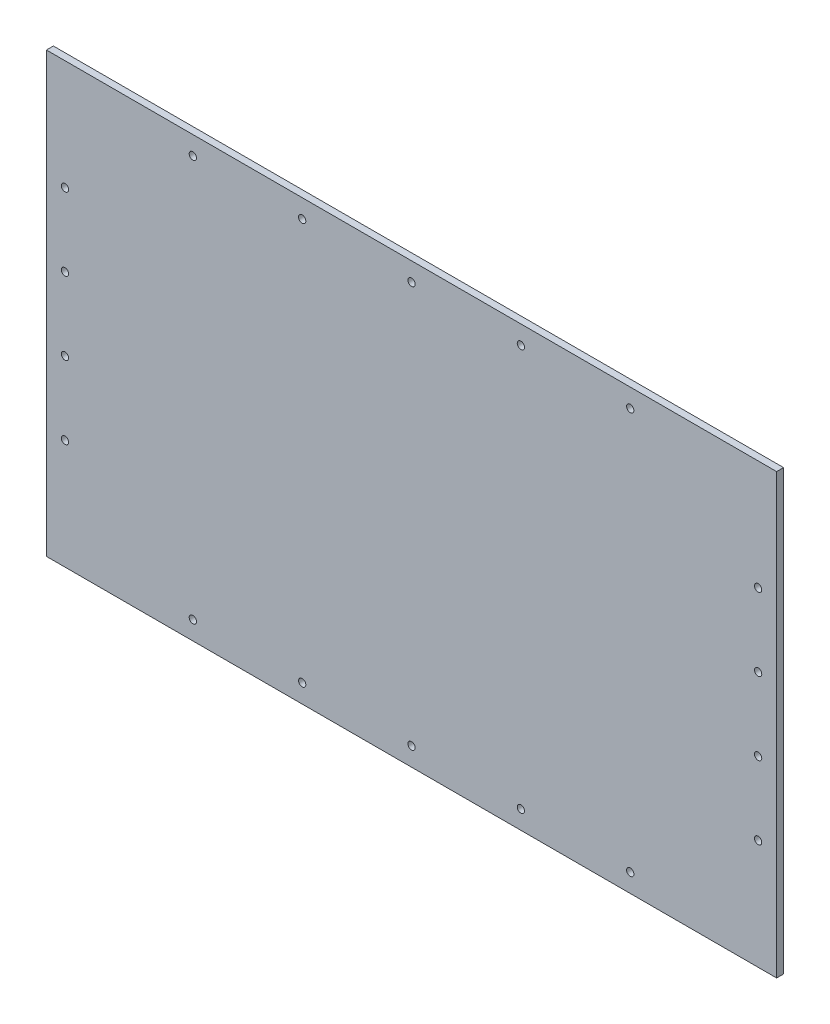
ISO-10303-21;
HEADER;
FILE_DESCRIPTION(('STEP AP214'),'2;1');
FILE_NAME('part.step','',(''),(''),'','','');
FILE_SCHEMA(('AUTOMOTIVE_DESIGN { 1 0 10303 214 1 1 1 1 }'));
ENDSEC;
DATA;
#1=APPLICATION_CONTEXT('core data for automotive mechanical design processes');
#2=APPLICATION_PROTOCOL_DEFINITION('international standard','automotive_design',2000,#1);
#3=PRODUCT_CONTEXT('',#1,'mechanical');
#4=PRODUCT('Part','Part','',(#3));
#5=PRODUCT_RELATED_PRODUCT_CATEGORY('part','',(#4));
#6=PRODUCT_DEFINITION_FORMATION('','',#4);
#7=PRODUCT_DEFINITION_CONTEXT('part definition',#1,'design');
#8=PRODUCT_DEFINITION('design','',#6,#7);
#9=PRODUCT_DEFINITION_SHAPE('','',#8);
#10=(LENGTH_UNIT() NAMED_UNIT(*) SI_UNIT(.MILLI.,.METRE.));
#11=(NAMED_UNIT(*) PLANE_ANGLE_UNIT() SI_UNIT($,.RADIAN.));
#12=(NAMED_UNIT(*) SI_UNIT($,.STERADIAN.) SOLID_ANGLE_UNIT());
#13=UNCERTAINTY_MEASURE_WITH_UNIT(LENGTH_MEASURE(1.E-05),#10,'distance_accuracy_value','');
#14=(GEOMETRIC_REPRESENTATION_CONTEXT(3) GLOBAL_UNCERTAINTY_ASSIGNED_CONTEXT((#13)) GLOBAL_UNIT_ASSIGNED_CONTEXT((#10,
#11,#12)) REPRESENTATION_CONTEXT('',''));
#15=CARTESIAN_POINT('',(0.,0.,0.));
#16=DIRECTION('',(0.,0.,1.));
#17=DIRECTION('',(1.,0.,0.));
#18=AXIS2_PLACEMENT_3D('',#15,#16,#17);
#19=CARTESIAN_POINT('',(-250.4,150.400000000001,4.75));
#20=DIRECTION('',(1.,0.,0.));
#21=DIRECTION('',(0.,1.,0.));
#22=AXIS2_PLACEMENT_3D('',#19,#20,#21);
#23=PLANE('',#22);
#24=DIRECTION('',(0.,-1.,0.));
#25=VECTOR('',#24,1.);
#26=CARTESIAN_POINT('',(-250.4,150.400000000001,0.));
#27=LINE('',#26,#25);
#28=CARTESIAN_POINT('',(-250.4,150.400000000001,0.));
#29=VERTEX_POINT('',#28);
#30=CARTESIAN_POINT('',(-250.4,-150.399999999999,0.));
#31=VERTEX_POINT('',#30);
#32=EDGE_CURVE('E98',#29,#31,#27,.T.);
#33=ORIENTED_EDGE('',*,*,#32,.T.);
#34=DIRECTION('',(0.,0.,-1.));
#35=VECTOR('',#34,1.);
#36=CARTESIAN_POINT('',(-250.4,-150.399999999999,4.75));
#37=LINE('',#36,#35);
#38=CARTESIAN_POINT('',(-250.4,-150.399999999999,4.75));
#39=VERTEX_POINT('',#38);
#40=EDGE_CURVE('E11',#39,#31,#37,.T.);
#41=ORIENTED_EDGE('',*,*,#40,.F.);
#42=DIRECTION('',(0.,-1.,0.));
#43=VECTOR('',#42,1.);
#44=CARTESIAN_POINT('',(-250.4,150.400000000001,4.75));
#45=LINE('',#44,#43);
#46=CARTESIAN_POINT('',(-250.4,150.400000000001,4.75));
#47=VERTEX_POINT('',#46);
#48=EDGE_CURVE('E84',#47,#39,#45,.T.);
#49=ORIENTED_EDGE('',*,*,#48,.F.);
#50=DIRECTION('',(0.,0.,-1.));
#51=VECTOR('',#50,1.);
#52=CARTESIAN_POINT('',(-250.4,150.400000000001,4.75));
#53=LINE('',#52,#51);
#54=EDGE_CURVE('E51',#47,#29,#53,.T.);
#55=ORIENTED_EDGE('',*,*,#54,.T.);
#56=EDGE_LOOP('',(#33,#41,#49,#55));
#57=FACE_BOUND('',#56,.T.);
#58=ADVANCED_FACE('F35',(#57),#23,.F.);
#59=CARTESIAN_POINT('',(-250.4,-150.399999999999,4.75));
#60=DIRECTION('',(0.,1.,0.));
#61=DIRECTION('',(0.,0.,1.));
#62=AXIS2_PLACEMENT_3D('',#59,#60,#61);
#63=PLANE('',#62);
#64=DIRECTION('',(1.,0.,0.));
#65=VECTOR('',#64,1.);
#66=CARTESIAN_POINT('',(-250.4,-150.399999999999,0.));
#67=LINE('',#66,#65);
#68=CARTESIAN_POINT('',(250.4,-150.399999999999,0.));
#69=VERTEX_POINT('',#68);
#70=EDGE_CURVE('E89',#31,#69,#67,.T.);
#71=ORIENTED_EDGE('',*,*,#70,.T.);
#72=DIRECTION('',(0.,0.,-1.));
#73=VECTOR('',#72,1.);
#74=CARTESIAN_POINT('',(250.4,-150.399999999999,4.75));
#75=LINE('',#74,#73);
#76=CARTESIAN_POINT('',(250.4,-150.399999999999,4.75));
#77=VERTEX_POINT('',#76);
#78=EDGE_CURVE('E43',#77,#69,#75,.T.);
#79=ORIENTED_EDGE('',*,*,#78,.F.);
#80=DIRECTION('',(1.,0.,0.));
#81=VECTOR('',#80,1.);
#82=CARTESIAN_POINT('',(-250.4,-150.399999999999,4.75));
#83=LINE('',#82,#81);
#84=EDGE_CURVE('E76',#39,#77,#83,.T.);
#85=ORIENTED_EDGE('',*,*,#84,.F.);
#86=ORIENTED_EDGE('',*,*,#40,.T.);
#87=EDGE_LOOP('',(#71,#79,#85,#86));
#88=FACE_BOUND('',#87,.T.);
#89=ADVANCED_FACE('F88',(#88),#63,.F.);
#90=CARTESIAN_POINT('',(250.4,150.400000000001,4.75));
#91=DIRECTION('',(1.,0.,0.));
#92=DIRECTION('',(0.,1.,0.));
#93=AXIS2_PLACEMENT_3D('',#90,#91,#92);
#94=PLANE('',#93);
#95=DIRECTION('',(0.,-1.,0.));
#96=VECTOR('',#95,1.);
#97=CARTESIAN_POINT('',(250.4,150.400000000001,0.));
#98=LINE('',#97,#96);
#99=CARTESIAN_POINT('',(250.4,150.400000000001,0.));
#100=VERTEX_POINT('',#99);
#101=EDGE_CURVE('E102',#100,#69,#98,.T.);
#102=ORIENTED_EDGE('',*,*,#101,.F.);
#103=DIRECTION('',(0.,0.,-1.));
#104=VECTOR('',#103,1.);
#105=CARTESIAN_POINT('',(250.4,150.400000000001,4.75));
#106=LINE('',#105,#104);
#107=CARTESIAN_POINT('',(250.4,150.400000000001,4.75));
#108=VERTEX_POINT('',#107);
#109=EDGE_CURVE('E65',#108,#100,#106,.T.);
#110=ORIENTED_EDGE('',*,*,#109,.F.);
#111=DIRECTION('',(0.,-1.,0.));
#112=VECTOR('',#111,1.);
#113=CARTESIAN_POINT('',(250.4,150.400000000001,4.75));
#114=LINE('',#113,#112);
#115=EDGE_CURVE('E83',#108,#77,#114,.T.);
#116=ORIENTED_EDGE('',*,*,#115,.T.);
#117=ORIENTED_EDGE('',*,*,#78,.T.);
#118=EDGE_LOOP('',(#102,#110,#116,#117));
#119=FACE_BOUND('',#118,.T.);
#120=ADVANCED_FACE('F92',(#119),#94,.T.);
#121=CARTESIAN_POINT('',(-250.4,150.400000000001,4.75));
#122=DIRECTION('',(0.,1.,0.));
#123=DIRECTION('',(0.,0.,1.));
#124=AXIS2_PLACEMENT_3D('',#121,#122,#123);
#125=PLANE('',#124);
#126=DIRECTION('',(1.,0.,0.));
#127=VECTOR('',#126,1.);
#128=CARTESIAN_POINT('',(-250.4,150.400000000001,0.));
#129=LINE('',#128,#127);
#130=EDGE_CURVE('E104',#29,#100,#129,.T.);
#131=ORIENTED_EDGE('',*,*,#130,.F.);
#132=ORIENTED_EDGE('',*,*,#54,.F.);
#133=DIRECTION('',(1.,0.,0.));
#134=VECTOR('',#133,1.);
#135=CARTESIAN_POINT('',(-250.4,150.400000000001,4.75));
#136=LINE('',#135,#134);
#137=EDGE_CURVE('E93',#47,#108,#136,.T.);
#138=ORIENTED_EDGE('',*,*,#137,.T.);
#139=ORIENTED_EDGE('',*,*,#109,.T.);
#140=EDGE_LOOP('',(#131,#132,#138,#139));
#141=FACE_BOUND('',#140,.T.);
#142=ADVANCED_FACE('F258',(#141),#125,.T.);
#143=CARTESIAN_POINT('',(0.,0.,4.75));
#144=DIRECTION('',(0.,0.,1.));
#145=DIRECTION('',(1.,0.,0.));
#146=AXIS2_PLACEMENT_3D('',#143,#144,#145);
#147=PLANE('',#146);
#148=CARTESIAN_POINT('',(-150.,-137.699999999999,4.75));
#149=DIRECTION('',(0.,0.,1.));
#150=DIRECTION('',(1.,0.,0.));
#151=AXIS2_PLACEMENT_3D('',#148,#149,#150);
#152=CIRCLE('',#151,2.5);
#153=CARTESIAN_POINT('',(-147.5,-137.699999999999,4.75));
#154=VERTEX_POINT('',#153);
#155=EDGE_CURVE('E180',#154,#154,#152,.T.);
#156=ORIENTED_EDGE('',*,*,#155,.F.);
#157=EDGE_LOOP('',(#156));
#158=FACE_BOUND('',#157,.T.);
#159=CARTESIAN_POINT('',(-75.,-137.7,4.75));
#160=DIRECTION('',(0.,0.,1.));
#161=DIRECTION('',(1.,0.,0.));
#162=AXIS2_PLACEMENT_3D('',#159,#160,#161);
#163=CIRCLE('',#162,2.5);
#164=CARTESIAN_POINT('',(-72.5,-137.7,4.75));
#165=VERTEX_POINT('',#164);
#166=EDGE_CURVE('E190',#165,#165,#163,.T.);
#167=ORIENTED_EDGE('',*,*,#166,.F.);
#168=EDGE_LOOP('',(#167));
#169=FACE_BOUND('',#168,.T.);
#170=CARTESIAN_POINT('',(0.,-137.7,4.75));
#171=DIRECTION('',(0.,0.,1.));
#172=DIRECTION('',(1.,0.,0.));
#173=AXIS2_PLACEMENT_3D('',#170,#171,#172);
#174=CIRCLE('',#173,2.5);
#175=CARTESIAN_POINT('',(2.50000000000002,-137.7,4.75));
#176=VERTEX_POINT('',#175);
#177=EDGE_CURVE('E193',#176,#176,#174,.T.);
#178=ORIENTED_EDGE('',*,*,#177,.F.);
#179=EDGE_LOOP('',(#178));
#180=FACE_BOUND('',#179,.T.);
#181=CARTESIAN_POINT('',(75.,-137.700000000001,4.75));
#182=DIRECTION('',(0.,0.,1.));
#183=DIRECTION('',(1.,0.,0.));
#184=AXIS2_PLACEMENT_3D('',#181,#182,#183);
#185=CIRCLE('',#184,2.5);
#186=CARTESIAN_POINT('',(77.5,-137.700000000001,4.75));
#187=VERTEX_POINT('',#186);
#188=EDGE_CURVE('E196',#187,#187,#185,.T.);
#189=ORIENTED_EDGE('',*,*,#188,.F.);
#190=EDGE_LOOP('',(#189));
#191=FACE_BOUND('',#190,.T.);
#192=CARTESIAN_POINT('',(150.,-137.700000000001,4.75));
#193=DIRECTION('',(0.,0.,1.));
#194=DIRECTION('',(1.,0.,0.));
#195=AXIS2_PLACEMENT_3D('',#192,#193,#194);
#196=CIRCLE('',#195,2.5);
#197=CARTESIAN_POINT('',(152.5,-137.700000000001,4.75));
#198=VERTEX_POINT('',#197);
#199=EDGE_CURVE('E199',#198,#198,#196,.T.);
#200=ORIENTED_EDGE('',*,*,#199,.F.);
#201=EDGE_LOOP('',(#200));
#202=FACE_BOUND('',#201,.T.);
#203=CARTESIAN_POINT('',(-237.7,75.0000000000008,4.75));
#204=DIRECTION('',(0.,0.,1.));
#205=DIRECTION('',(1.,0.,0.));
#206=AXIS2_PLACEMENT_3D('',#203,#204,#205);
#207=CIRCLE('',#206,2.5);
#208=CARTESIAN_POINT('',(-235.2,75.0000000000008,4.75));
#209=VERTEX_POINT('',#208);
#210=EDGE_CURVE('E156',#209,#209,#207,.T.);
#211=ORIENTED_EDGE('',*,*,#210,.F.);
#212=EDGE_LOOP('',(#211));
#213=FACE_BOUND('',#212,.T.);
#214=CARTESIAN_POINT('',(-237.700000000001,25.0000000000007,4.75));
#215=DIRECTION('',(0.,0.,1.));
#216=DIRECTION('',(1.,0.,0.));
#217=AXIS2_PLACEMENT_3D('',#214,#215,#216);
#218=CIRCLE('',#217,2.5);
#219=CARTESIAN_POINT('',(-235.200000000001,25.0000000000007,4.75));
#220=VERTEX_POINT('',#219);
#221=EDGE_CURVE('E166',#220,#220,#218,.T.);
#222=ORIENTED_EDGE('',*,*,#221,.F.);
#223=EDGE_LOOP('',(#222));
#224=FACE_BOUND('',#223,.T.);
#225=CARTESIAN_POINT('',(-237.700000000001,-24.9999999999993,4.75));
#226=DIRECTION('',(0.,0.,1.));
#227=DIRECTION('',(1.,0.,0.));
#228=AXIS2_PLACEMENT_3D('',#225,#226,#227);
#229=CIRCLE('',#228,2.5);
#230=CARTESIAN_POINT('',(-235.200000000001,-24.9999999999993,4.75));
#231=VERTEX_POINT('',#230);
#232=EDGE_CURVE('E169',#231,#231,#229,.T.);
#233=ORIENTED_EDGE('',*,*,#232,.F.);
#234=EDGE_LOOP('',(#233));
#235=FACE_BOUND('',#234,.T.);
#236=CARTESIAN_POINT('',(-237.700000000002,-74.9999999999993,4.75));
#237=DIRECTION('',(0.,0.,1.));
#238=DIRECTION('',(1.,0.,0.));
#239=AXIS2_PLACEMENT_3D('',#236,#237,#238);
#240=CIRCLE('',#239,2.5);
#241=CARTESIAN_POINT('',(-235.200000000002,-74.9999999999993,4.75));
#242=VERTEX_POINT('',#241);
#243=EDGE_CURVE('E172',#242,#242,#240,.T.);
#244=ORIENTED_EDGE('',*,*,#243,.F.);
#245=EDGE_LOOP('',(#244));
#246=FACE_BOUND('',#245,.T.);
#247=CARTESIAN_POINT('',(237.7,75.0000000000008,4.75));
#248=DIRECTION('',(0.,0.,1.));
#249=DIRECTION('',(1.,0.,0.));
#250=AXIS2_PLACEMENT_3D('',#247,#248,#249);
#251=CIRCLE('',#250,2.5);
#252=CARTESIAN_POINT('',(240.2,75.0000000000008,4.75));
#253=VERTEX_POINT('',#252);
#254=EDGE_CURVE('E129',#253,#253,#251,.T.);
#255=ORIENTED_EDGE('',*,*,#254,.F.);
#256=EDGE_LOOP('',(#255));
#257=FACE_BOUND('',#256,.T.);
#258=CARTESIAN_POINT('',(237.7,25.0000000000007,4.75));
#259=DIRECTION('',(0.,0.,1.));
#260=DIRECTION('',(1.,0.,0.));
#261=AXIS2_PLACEMENT_3D('',#258,#259,#260);
#262=CIRCLE('',#261,2.5);
#263=CARTESIAN_POINT('',(240.2,25.0000000000007,4.75));
#264=VERTEX_POINT('',#263);
#265=EDGE_CURVE('E142',#264,#264,#262,.T.);
#266=ORIENTED_EDGE('',*,*,#265,.F.);
#267=EDGE_LOOP('',(#266));
#268=FACE_BOUND('',#267,.T.);
#269=CARTESIAN_POINT('',(237.699999999999,-24.9999999999993,4.75));
#270=DIRECTION('',(0.,0.,1.));
#271=DIRECTION('',(1.,0.,0.));
#272=AXIS2_PLACEMENT_3D('',#269,#270,#271);
#273=CIRCLE('',#272,2.5);
#274=CARTESIAN_POINT('',(240.199999999999,-24.9999999999993,4.75));
#275=VERTEX_POINT('',#274);
#276=EDGE_CURVE('E145',#275,#275,#273,.T.);
#277=ORIENTED_EDGE('',*,*,#276,.F.);
#278=EDGE_LOOP('',(#277));
#279=FACE_BOUND('',#278,.T.);
#280=CARTESIAN_POINT('',(237.699999999999,-74.9999999999993,4.75));
#281=DIRECTION('',(0.,0.,1.));
#282=DIRECTION('',(1.,0.,0.));
#283=AXIS2_PLACEMENT_3D('',#280,#281,#282);
#284=CIRCLE('',#283,2.5);
#285=CARTESIAN_POINT('',(240.199999999999,-74.9999999999993,4.75));
#286=VERTEX_POINT('',#285);
#287=EDGE_CURVE('E148',#286,#286,#284,.T.);
#288=ORIENTED_EDGE('',*,*,#287,.F.);
#289=EDGE_LOOP('',(#288));
#290=FACE_BOUND('',#289,.T.);
#291=CARTESIAN_POINT('',(150.,137.700000000001,4.75));
#292=DIRECTION('',(0.,0.,1.));
#293=DIRECTION('',(1.,0.,0.));
#294=AXIS2_PLACEMENT_3D('',#291,#292,#293);
#295=CIRCLE('',#294,2.5);
#296=CARTESIAN_POINT('',(152.5,137.700000000001,4.75));
#297=VERTEX_POINT('',#296);
#298=EDGE_CURVE('E100',#297,#297,#295,.T.);
#299=ORIENTED_EDGE('',*,*,#298,.F.);
#300=EDGE_LOOP('',(#299));
#301=FACE_BOUND('',#300,.T.);
#302=CARTESIAN_POINT('',(75.0000000000001,137.700000000001,4.75));
#303=DIRECTION('',(0.,0.,1.));
#304=DIRECTION('',(1.,0.,0.));
#305=AXIS2_PLACEMENT_3D('',#302,#303,#304);
#306=CIRCLE('',#305,2.5);
#307=CARTESIAN_POINT('',(77.5000000000001,137.700000000001,4.75));
#308=VERTEX_POINT('',#307);
#309=EDGE_CURVE('E112',#308,#308,#306,.T.);
#310=ORIENTED_EDGE('',*,*,#309,.F.);
#311=EDGE_LOOP('',(#310));
#312=FACE_BOUND('',#311,.T.);
#313=CARTESIAN_POINT('',(0.,137.700000000001,4.75));
#314=DIRECTION('',(0.,0.,1.));
#315=DIRECTION('',(1.,0.,0.));
#316=AXIS2_PLACEMENT_3D('',#313,#314,#315);
#317=CIRCLE('',#316,2.5);
#318=CARTESIAN_POINT('',(2.50000000000008,137.700000000001,4.75));
#319=VERTEX_POINT('',#318);
#320=EDGE_CURVE('E115',#319,#319,#317,.T.);
#321=ORIENTED_EDGE('',*,*,#320,.F.);
#322=EDGE_LOOP('',(#321));
#323=FACE_BOUND('',#322,.T.);
#324=CARTESIAN_POINT('',(-74.9999999999999,137.700000000001,4.75));
#325=DIRECTION('',(0.,0.,1.));
#326=DIRECTION('',(1.,0.,0.));
#327=AXIS2_PLACEMENT_3D('',#324,#325,#326);
#328=CIRCLE('',#327,2.5);
#329=CARTESIAN_POINT('',(-72.4999999999999,137.700000000001,4.75));
#330=VERTEX_POINT('',#329);
#331=EDGE_CURVE('E118',#330,#330,#328,.T.);
#332=ORIENTED_EDGE('',*,*,#331,.F.);
#333=EDGE_LOOP('',(#332));
#334=FACE_BOUND('',#333,.T.);
#335=CARTESIAN_POINT('',(-150.,137.700000000001,4.75));
#336=DIRECTION('',(0.,0.,1.));
#337=DIRECTION('',(1.,0.,0.));
#338=AXIS2_PLACEMENT_3D('',#335,#336,#337);
#339=CIRCLE('',#338,2.5);
#340=CARTESIAN_POINT('',(-147.5,137.700000000001,4.75));
#341=VERTEX_POINT('',#340);
#342=EDGE_CURVE('E121',#341,#341,#339,.T.);
#343=ORIENTED_EDGE('',*,*,#342,.F.);
#344=EDGE_LOOP('',(#343));
#345=FACE_BOUND('',#344,.T.);
#346=ORIENTED_EDGE('',*,*,#48,.T.);
#347=ORIENTED_EDGE('',*,*,#84,.T.);
#348=ORIENTED_EDGE('',*,*,#115,.F.);
#349=ORIENTED_EDGE('',*,*,#137,.F.);
#350=EDGE_LOOP('',(#346,#347,#348,#349));
#351=FACE_BOUND('',#350,.T.);
#352=ADVANCED_FACE('F80',(#158,#169,#180,#191,#202,#213,#224,#235,#246,#257,#268,#279,#290,#301,
#312,#323,#334,#345,#351),#147,.T.);
#353=CARTESIAN_POINT('',(0.,0.,0.));
#354=DIRECTION('',(0.,0.,1.));
#355=DIRECTION('',(1.,0.,0.));
#356=AXIS2_PLACEMENT_3D('',#353,#354,#355);
#357=PLANE('',#356);
#358=CARTESIAN_POINT('',(-150.,-137.699999999999,0.));
#359=DIRECTION('',(0.,0.,-1.));
#360=DIRECTION('',(-1.,0.,0.));
#361=AXIS2_PLACEMENT_3D('',#358,#359,#360);
#362=CIRCLE('',#361,2.5);
#363=CARTESIAN_POINT('',(-152.5,-137.699999999999,0.));
#364=VERTEX_POINT('',#363);
#365=EDGE_CURVE('E202',#364,#364,#362,.T.);
#366=ORIENTED_EDGE('',*,*,#365,.F.);
#367=EDGE_LOOP('',(#366));
#368=FACE_BOUND('',#367,.T.);
#369=CARTESIAN_POINT('',(-75.,-137.7,0.));
#370=DIRECTION('',(0.,0.,-1.));
#371=DIRECTION('',(-1.,0.,0.));
#372=AXIS2_PLACEMENT_3D('',#369,#370,#371);
#373=CIRCLE('',#372,2.5);
#374=CARTESIAN_POINT('',(-77.5,-137.7,0.));
#375=VERTEX_POINT('',#374);
#376=EDGE_CURVE('E212',#375,#375,#373,.T.);
#377=ORIENTED_EDGE('',*,*,#376,.F.);
#378=EDGE_LOOP('',(#377));
#379=FACE_BOUND('',#378,.T.);
#380=CARTESIAN_POINT('',(0.,-137.7,0.));
#381=DIRECTION('',(0.,0.,-1.));
#382=DIRECTION('',(-1.,0.,0.));
#383=AXIS2_PLACEMENT_3D('',#380,#381,#382);
#384=CIRCLE('',#383,2.5);
#385=CARTESIAN_POINT('',(-2.49999999999997,-137.7,0.));
#386=VERTEX_POINT('',#385);
#387=EDGE_CURVE('E209',#386,#386,#384,.T.);
#388=ORIENTED_EDGE('',*,*,#387,.F.);
#389=EDGE_LOOP('',(#388));
#390=FACE_BOUND('',#389,.T.);
#391=CARTESIAN_POINT('',(75.,-137.700000000001,0.));
#392=DIRECTION('',(0.,0.,-1.));
#393=DIRECTION('',(-1.,0.,0.));
#394=AXIS2_PLACEMENT_3D('',#391,#392,#393);
#395=CIRCLE('',#394,2.5);
#396=CARTESIAN_POINT('',(72.5,-137.700000000001,0.));
#397=VERTEX_POINT('',#396);
#398=EDGE_CURVE('E206',#397,#397,#395,.T.);
#399=ORIENTED_EDGE('',*,*,#398,.F.);
#400=EDGE_LOOP('',(#399));
#401=FACE_BOUND('',#400,.T.);
#402=CARTESIAN_POINT('',(150.,-137.700000000001,0.));
#403=DIRECTION('',(0.,0.,-1.));
#404=DIRECTION('',(-1.,0.,0.));
#405=AXIS2_PLACEMENT_3D('',#402,#403,#404);
#406=CIRCLE('',#405,2.5);
#407=CARTESIAN_POINT('',(147.5,-137.700000000001,0.));
#408=VERTEX_POINT('',#407);
#409=EDGE_CURVE('E203',#408,#408,#406,.T.);
#410=ORIENTED_EDGE('',*,*,#409,.F.);
#411=EDGE_LOOP('',(#410));
#412=FACE_BOUND('',#411,.T.);
#413=CARTESIAN_POINT('',(-237.7,75.0000000000008,0.));
#414=DIRECTION('',(0.,0.,-1.));
#415=DIRECTION('',(-1.,0.,0.));
#416=AXIS2_PLACEMENT_3D('',#413,#414,#415);
#417=CIRCLE('',#416,2.5);
#418=CARTESIAN_POINT('',(-240.2,75.0000000000008,0.));
#419=VERTEX_POINT('',#418);
#420=EDGE_CURVE('E175',#419,#419,#417,.T.);
#421=ORIENTED_EDGE('',*,*,#420,.F.);
#422=EDGE_LOOP('',(#421));
#423=FACE_BOUND('',#422,.T.);
#424=CARTESIAN_POINT('',(-237.700000000001,25.0000000000007,0.));
#425=DIRECTION('',(0.,0.,-1.));
#426=DIRECTION('',(-1.,0.,0.));
#427=AXIS2_PLACEMENT_3D('',#424,#425,#426);
#428=CIRCLE('',#427,2.5);
#429=CARTESIAN_POINT('',(-240.200000000001,25.0000000000007,0.));
#430=VERTEX_POINT('',#429);
#431=EDGE_CURVE('E183',#430,#430,#428,.T.);
#432=ORIENTED_EDGE('',*,*,#431,.F.);
#433=EDGE_LOOP('',(#432));
#434=FACE_BOUND('',#433,.T.);
#435=CARTESIAN_POINT('',(-237.700000000001,-24.9999999999993,0.));
#436=DIRECTION('',(0.,0.,-1.));
#437=DIRECTION('',(-1.,0.,0.));
#438=AXIS2_PLACEMENT_3D('',#435,#436,#437);
#439=CIRCLE('',#438,2.5);
#440=CARTESIAN_POINT('',(-240.200000000001,-24.9999999999993,0.));
#441=VERTEX_POINT('',#440);
#442=EDGE_CURVE('E179',#441,#441,#439,.T.);
#443=ORIENTED_EDGE('',*,*,#442,.F.);
#444=EDGE_LOOP('',(#443));
#445=FACE_BOUND('',#444,.T.);
#446=CARTESIAN_POINT('',(-237.700000000002,-74.9999999999993,0.));
#447=DIRECTION('',(0.,0.,-1.));
#448=DIRECTION('',(-1.,0.,0.));
#449=AXIS2_PLACEMENT_3D('',#446,#447,#448);
#450=CIRCLE('',#449,2.5);
#451=CARTESIAN_POINT('',(-240.200000000002,-74.9999999999993,0.));
#452=VERTEX_POINT('',#451);
#453=EDGE_CURVE('E176',#452,#452,#450,.T.);
#454=ORIENTED_EDGE('',*,*,#453,.F.);
#455=EDGE_LOOP('',(#454));
#456=FACE_BOUND('',#455,.T.);
#457=CARTESIAN_POINT('',(237.7,75.0000000000008,0.));
#458=DIRECTION('',(0.,0.,-1.));
#459=DIRECTION('',(-1.,0.,0.));
#460=AXIS2_PLACEMENT_3D('',#457,#458,#459);
#461=CIRCLE('',#460,2.5);
#462=CARTESIAN_POINT('',(235.2,75.0000000000008,0.));
#463=VERTEX_POINT('',#462);
#464=EDGE_CURVE('E151',#463,#463,#461,.T.);
#465=ORIENTED_EDGE('',*,*,#464,.F.);
#466=EDGE_LOOP('',(#465));
#467=FACE_BOUND('',#466,.T.);
#468=CARTESIAN_POINT('',(237.7,25.0000000000007,0.));
#469=DIRECTION('',(0.,0.,-1.));
#470=DIRECTION('',(-1.,0.,0.));
#471=AXIS2_PLACEMENT_3D('',#468,#469,#470);
#472=CIRCLE('',#471,2.5);
#473=CARTESIAN_POINT('',(235.2,25.0000000000007,0.));
#474=VERTEX_POINT('',#473);
#475=EDGE_CURVE('E159',#474,#474,#472,.T.);
#476=ORIENTED_EDGE('',*,*,#475,.F.);
#477=EDGE_LOOP('',(#476));
#478=FACE_BOUND('',#477,.T.);
#479=CARTESIAN_POINT('',(237.699999999999,-24.9999999999993,0.));
#480=DIRECTION('',(0.,0.,-1.));
#481=DIRECTION('',(-1.,0.,0.));
#482=AXIS2_PLACEMENT_3D('',#479,#480,#481);
#483=CIRCLE('',#482,2.5);
#484=CARTESIAN_POINT('',(235.199999999999,-24.9999999999993,0.));
#485=VERTEX_POINT('',#484);
#486=EDGE_CURVE('E155',#485,#485,#483,.T.);
#487=ORIENTED_EDGE('',*,*,#486,.F.);
#488=EDGE_LOOP('',(#487));
#489=FACE_BOUND('',#488,.T.);
#490=CARTESIAN_POINT('',(237.699999999999,-74.9999999999993,0.));
#491=DIRECTION('',(0.,0.,-1.));
#492=DIRECTION('',(-1.,0.,0.));
#493=AXIS2_PLACEMENT_3D('',#490,#491,#492);
#494=CIRCLE('',#493,2.5);
#495=CARTESIAN_POINT('',(235.199999999999,-74.9999999999993,0.));
#496=VERTEX_POINT('',#495);
#497=EDGE_CURVE('E152',#496,#496,#494,.T.);
#498=ORIENTED_EDGE('',*,*,#497,.F.);
#499=EDGE_LOOP('',(#498));
#500=FACE_BOUND('',#499,.T.);
#501=CARTESIAN_POINT('',(150.,137.700000000001,0.));
#502=DIRECTION('',(0.,0.,-1.));
#503=DIRECTION('',(-1.,0.,0.));
#504=AXIS2_PLACEMENT_3D('',#501,#502,#503);
#505=CIRCLE('',#504,2.5);
#506=CARTESIAN_POINT('',(147.5,137.700000000001,0.));
#507=VERTEX_POINT('',#506);
#508=EDGE_CURVE('E124',#507,#507,#505,.T.);
#509=ORIENTED_EDGE('',*,*,#508,.F.);
#510=EDGE_LOOP('',(#509));
#511=FACE_BOUND('',#510,.T.);
#512=CARTESIAN_POINT('',(75.0000000000001,137.700000000001,0.));
#513=DIRECTION('',(0.,0.,-1.));
#514=DIRECTION('',(-1.,0.,0.));
#515=AXIS2_PLACEMENT_3D('',#512,#513,#514);
#516=CIRCLE('',#515,2.5);
#517=CARTESIAN_POINT('',(72.5000000000001,137.700000000001,0.));
#518=VERTEX_POINT('',#517);
#519=EDGE_CURVE('E135',#518,#518,#516,.T.);
#520=ORIENTED_EDGE('',*,*,#519,.F.);
#521=EDGE_LOOP('',(#520));
#522=FACE_BOUND('',#521,.T.);
#523=CARTESIAN_POINT('',(0.,137.700000000001,0.));
#524=DIRECTION('',(0.,0.,-1.));
#525=DIRECTION('',(-1.,0.,0.));
#526=AXIS2_PLACEMENT_3D('',#523,#524,#525);
#527=CIRCLE('',#526,2.5);
#528=CARTESIAN_POINT('',(-2.49999999999991,137.700000000001,0.));
#529=VERTEX_POINT('',#528);
#530=EDGE_CURVE('E132',#529,#529,#527,.T.);
#531=ORIENTED_EDGE('',*,*,#530,.F.);
#532=EDGE_LOOP('',(#531));
#533=FACE_BOUND('',#532,.T.);
#534=CARTESIAN_POINT('',(-74.9999999999999,137.700000000001,0.));
#535=DIRECTION('',(0.,0.,-1.));
#536=DIRECTION('',(-1.,0.,0.));
#537=AXIS2_PLACEMENT_3D('',#534,#535,#536);
#538=CIRCLE('',#537,2.5);
#539=CARTESIAN_POINT('',(-77.4999999999999,137.700000000001,0.));
#540=VERTEX_POINT('',#539);
#541=EDGE_CURVE('E128',#540,#540,#538,.T.);
#542=ORIENTED_EDGE('',*,*,#541,.F.);
#543=EDGE_LOOP('',(#542));
#544=FACE_BOUND('',#543,.T.);
#545=CARTESIAN_POINT('',(-150.,137.700000000001,0.));
#546=DIRECTION('',(0.,0.,-1.));
#547=DIRECTION('',(-1.,0.,0.));
#548=AXIS2_PLACEMENT_3D('',#545,#546,#547);
#549=CIRCLE('',#548,2.5);
#550=CARTESIAN_POINT('',(-152.5,137.700000000001,0.));
#551=VERTEX_POINT('',#550);
#552=EDGE_CURVE('E125',#551,#551,#549,.T.);
#553=ORIENTED_EDGE('',*,*,#552,.F.);
#554=EDGE_LOOP('',(#553));
#555=FACE_BOUND('',#554,.T.);
#556=ORIENTED_EDGE('',*,*,#32,.F.);
#557=ORIENTED_EDGE('',*,*,#130,.T.);
#558=ORIENTED_EDGE('',*,*,#101,.T.);
#559=ORIENTED_EDGE('',*,*,#70,.F.);
#560=EDGE_LOOP('',(#556,#557,#558,#559));
#561=FACE_BOUND('',#560,.T.);
#562=ADVANCED_FACE('F220',(#368,#379,#390,#401,#412,#423,#434,#445,#456,#467,#478,#489,#500,
#511,#522,#533,#544,#555,#561),#357,.F.);
#563=CARTESIAN_POINT('',(-150.,137.700000000001,10.));
#564=DIRECTION('',(0.,0.,-1.));
#565=DIRECTION('',(-1.,0.,0.));
#566=AXIS2_PLACEMENT_3D('',#563,#564,#565);
#567=CYLINDRICAL_SURFACE('',#566,2.5);
#568=ORIENTED_EDGE('',*,*,#342,.T.);
#569=EDGE_LOOP('',(#568));
#570=FACE_BOUND('',#569,.T.);
#571=ORIENTED_EDGE('',*,*,#552,.T.);
#572=EDGE_LOOP('',(#571));
#573=FACE_BOUND('',#572,.T.);
#574=ADVANCED_FACE('F223',(#570,#573),#567,.F.);
#575=CARTESIAN_POINT('',(-74.9999999999999,137.700000000001,10.));
#576=DIRECTION('',(0.,0.,-1.));
#577=DIRECTION('',(-1.,0.,0.));
#578=AXIS2_PLACEMENT_3D('',#575,#576,#577);
#579=CYLINDRICAL_SURFACE('',#578,2.5);
#580=ORIENTED_EDGE('',*,*,#331,.T.);
#581=EDGE_LOOP('',(#580));
#582=FACE_BOUND('',#581,.T.);
#583=ORIENTED_EDGE('',*,*,#541,.T.);
#584=EDGE_LOOP('',(#583));
#585=FACE_BOUND('',#584,.T.);
#586=ADVANCED_FACE('F293',(#582,#585),#579,.F.);
#587=CARTESIAN_POINT('',(0.,137.700000000001,10.));
#588=DIRECTION('',(0.,0.,-1.));
#589=DIRECTION('',(-1.,0.,0.));
#590=AXIS2_PLACEMENT_3D('',#587,#588,#589);
#591=CYLINDRICAL_SURFACE('',#590,2.5);
#592=ORIENTED_EDGE('',*,*,#320,.T.);
#593=EDGE_LOOP('',(#592));
#594=FACE_BOUND('',#593,.T.);
#595=ORIENTED_EDGE('',*,*,#530,.T.);
#596=EDGE_LOOP('',(#595));
#597=FACE_BOUND('',#596,.T.);
#598=ADVANCED_FACE('F305',(#594,#597),#591,.F.);
#599=CARTESIAN_POINT('',(75.0000000000001,137.700000000001,10.));
#600=DIRECTION('',(0.,0.,-1.));
#601=DIRECTION('',(-1.,0.,0.));
#602=AXIS2_PLACEMENT_3D('',#599,#600,#601);
#603=CYLINDRICAL_SURFACE('',#602,2.5);
#604=ORIENTED_EDGE('',*,*,#309,.T.);
#605=EDGE_LOOP('',(#604));
#606=FACE_BOUND('',#605,.T.);
#607=ORIENTED_EDGE('',*,*,#519,.T.);
#608=EDGE_LOOP('',(#607));
#609=FACE_BOUND('',#608,.T.);
#610=ADVANCED_FACE('F315',(#606,#609),#603,.F.);
#611=CARTESIAN_POINT('',(150.,137.700000000001,10.));
#612=DIRECTION('',(0.,0.,-1.));
#613=DIRECTION('',(-1.,0.,0.));
#614=AXIS2_PLACEMENT_3D('',#611,#612,#613);
#615=CYLINDRICAL_SURFACE('',#614,2.5);
#616=ORIENTED_EDGE('',*,*,#298,.T.);
#617=EDGE_LOOP('',(#616));
#618=FACE_BOUND('',#617,.T.);
#619=ORIENTED_EDGE('',*,*,#508,.T.);
#620=EDGE_LOOP('',(#619));
#621=FACE_BOUND('',#620,.T.);
#622=ADVANCED_FACE('F325',(#618,#621),#615,.F.);
#623=CARTESIAN_POINT('',(237.699999999999,-74.9999999999993,10.));
#624=DIRECTION('',(0.,0.,-1.));
#625=DIRECTION('',(-1.,0.,0.));
#626=AXIS2_PLACEMENT_3D('',#623,#624,#625);
#627=CYLINDRICAL_SURFACE('',#626,2.5);
#628=ORIENTED_EDGE('',*,*,#287,.T.);
#629=EDGE_LOOP('',(#628));
#630=FACE_BOUND('',#629,.T.);
#631=ORIENTED_EDGE('',*,*,#497,.T.);
#632=EDGE_LOOP('',(#631));
#633=FACE_BOUND('',#632,.T.);
#634=ADVANCED_FACE('F335',(#630,#633),#627,.F.);
#635=CARTESIAN_POINT('',(237.699999999999,-24.9999999999993,10.));
#636=DIRECTION('',(0.,0.,-1.));
#637=DIRECTION('',(-1.,0.,0.));
#638=AXIS2_PLACEMENT_3D('',#635,#636,#637);
#639=CYLINDRICAL_SURFACE('',#638,2.5);
#640=ORIENTED_EDGE('',*,*,#276,.T.);
#641=EDGE_LOOP('',(#640));
#642=FACE_BOUND('',#641,.T.);
#643=ORIENTED_EDGE('',*,*,#486,.T.);
#644=EDGE_LOOP('',(#643));
#645=FACE_BOUND('',#644,.T.);
#646=ADVANCED_FACE('F345',(#642,#645),#639,.F.);
#647=CARTESIAN_POINT('',(237.7,25.0000000000007,10.));
#648=DIRECTION('',(0.,0.,-1.));
#649=DIRECTION('',(-1.,0.,0.));
#650=AXIS2_PLACEMENT_3D('',#647,#648,#649);
#651=CYLINDRICAL_SURFACE('',#650,2.5);
#652=ORIENTED_EDGE('',*,*,#265,.T.);
#653=EDGE_LOOP('',(#652));
#654=FACE_BOUND('',#653,.T.);
#655=ORIENTED_EDGE('',*,*,#475,.T.);
#656=EDGE_LOOP('',(#655));
#657=FACE_BOUND('',#656,.T.);
#658=ADVANCED_FACE('F355',(#654,#657),#651,.F.);
#659=CARTESIAN_POINT('',(237.7,75.0000000000008,10.));
#660=DIRECTION('',(0.,0.,-1.));
#661=DIRECTION('',(-1.,0.,0.));
#662=AXIS2_PLACEMENT_3D('',#659,#660,#661);
#663=CYLINDRICAL_SURFACE('',#662,2.5);
#664=ORIENTED_EDGE('',*,*,#254,.T.);
#665=EDGE_LOOP('',(#664));
#666=FACE_BOUND('',#665,.T.);
#667=ORIENTED_EDGE('',*,*,#464,.T.);
#668=EDGE_LOOP('',(#667));
#669=FACE_BOUND('',#668,.T.);
#670=ADVANCED_FACE('F365',(#666,#669),#663,.F.);
#671=CARTESIAN_POINT('',(-237.700000000002,-74.9999999999993,10.));
#672=DIRECTION('',(0.,0.,-1.));
#673=DIRECTION('',(-1.,0.,0.));
#674=AXIS2_PLACEMENT_3D('',#671,#672,#673);
#675=CYLINDRICAL_SURFACE('',#674,2.5);
#676=ORIENTED_EDGE('',*,*,#243,.T.);
#677=EDGE_LOOP('',(#676));
#678=FACE_BOUND('',#677,.T.);
#679=ORIENTED_EDGE('',*,*,#453,.T.);
#680=EDGE_LOOP('',(#679));
#681=FACE_BOUND('',#680,.T.);
#682=ADVANCED_FACE('F375',(#678,#681),#675,.F.);
#683=CARTESIAN_POINT('',(-237.700000000001,-24.9999999999993,10.));
#684=DIRECTION('',(0.,0.,-1.));
#685=DIRECTION('',(-1.,0.,0.));
#686=AXIS2_PLACEMENT_3D('',#683,#684,#685);
#687=CYLINDRICAL_SURFACE('',#686,2.5);
#688=ORIENTED_EDGE('',*,*,#232,.T.);
#689=EDGE_LOOP('',(#688));
#690=FACE_BOUND('',#689,.T.);
#691=ORIENTED_EDGE('',*,*,#442,.T.);
#692=EDGE_LOOP('',(#691));
#693=FACE_BOUND('',#692,.T.);
#694=ADVANCED_FACE('F385',(#690,#693),#687,.F.);
#695=CARTESIAN_POINT('',(-237.700000000001,25.0000000000007,10.));
#696=DIRECTION('',(0.,0.,-1.));
#697=DIRECTION('',(-1.,0.,0.));
#698=AXIS2_PLACEMENT_3D('',#695,#696,#697);
#699=CYLINDRICAL_SURFACE('',#698,2.5);
#700=ORIENTED_EDGE('',*,*,#221,.T.);
#701=EDGE_LOOP('',(#700));
#702=FACE_BOUND('',#701,.T.);
#703=ORIENTED_EDGE('',*,*,#431,.T.);
#704=EDGE_LOOP('',(#703));
#705=FACE_BOUND('',#704,.T.);
#706=ADVANCED_FACE('F395',(#702,#705),#699,.F.);
#707=CARTESIAN_POINT('',(-237.7,75.0000000000008,10.));
#708=DIRECTION('',(0.,0.,-1.));
#709=DIRECTION('',(-1.,0.,0.));
#710=AXIS2_PLACEMENT_3D('',#707,#708,#709);
#711=CYLINDRICAL_SURFACE('',#710,2.5);
#712=ORIENTED_EDGE('',*,*,#210,.T.);
#713=EDGE_LOOP('',(#712));
#714=FACE_BOUND('',#713,.T.);
#715=ORIENTED_EDGE('',*,*,#420,.T.);
#716=EDGE_LOOP('',(#715));
#717=FACE_BOUND('',#716,.T.);
#718=ADVANCED_FACE('F405',(#714,#717),#711,.F.);
#719=CARTESIAN_POINT('',(150.,-137.700000000001,10.));
#720=DIRECTION('',(0.,0.,-1.));
#721=DIRECTION('',(-1.,0.,0.));
#722=AXIS2_PLACEMENT_3D('',#719,#720,#721);
#723=CYLINDRICAL_SURFACE('',#722,2.5);
#724=ORIENTED_EDGE('',*,*,#199,.T.);
#725=EDGE_LOOP('',(#724));
#726=FACE_BOUND('',#725,.T.);
#727=ORIENTED_EDGE('',*,*,#409,.T.);
#728=EDGE_LOOP('',(#727));
#729=FACE_BOUND('',#728,.T.);
#730=ADVANCED_FACE('F414',(#726,#729),#723,.F.);
#731=CARTESIAN_POINT('',(75.,-137.700000000001,10.));
#732=DIRECTION('',(0.,0.,-1.));
#733=DIRECTION('',(-1.,0.,0.));
#734=AXIS2_PLACEMENT_3D('',#731,#732,#733);
#735=CYLINDRICAL_SURFACE('',#734,2.5);
#736=ORIENTED_EDGE('',*,*,#188,.T.);
#737=EDGE_LOOP('',(#736));
#738=FACE_BOUND('',#737,.T.);
#739=ORIENTED_EDGE('',*,*,#398,.T.);
#740=EDGE_LOOP('',(#739));
#741=FACE_BOUND('',#740,.T.);
#742=ADVANCED_FACE('F429',(#738,#741),#735,.F.);
#743=CARTESIAN_POINT('',(0.,-137.7,10.));
#744=DIRECTION('',(0.,0.,-1.));
#745=DIRECTION('',(-1.,0.,0.));
#746=AXIS2_PLACEMENT_3D('',#743,#744,#745);
#747=CYLINDRICAL_SURFACE('',#746,2.5);
#748=ORIENTED_EDGE('',*,*,#177,.T.);
#749=EDGE_LOOP('',(#748));
#750=FACE_BOUND('',#749,.T.);
#751=ORIENTED_EDGE('',*,*,#387,.T.);
#752=EDGE_LOOP('',(#751));
#753=FACE_BOUND('',#752,.T.);
#754=ADVANCED_FACE('F439',(#750,#753),#747,.F.);
#755=CARTESIAN_POINT('',(-75.,-137.7,10.));
#756=DIRECTION('',(0.,0.,-1.));
#757=DIRECTION('',(-1.,0.,0.));
#758=AXIS2_PLACEMENT_3D('',#755,#756,#757);
#759=CYLINDRICAL_SURFACE('',#758,2.5);
#760=ORIENTED_EDGE('',*,*,#166,.T.);
#761=EDGE_LOOP('',(#760));
#762=FACE_BOUND('',#761,.T.);
#763=ORIENTED_EDGE('',*,*,#376,.T.);
#764=EDGE_LOOP('',(#763));
#765=FACE_BOUND('',#764,.T.);
#766=ADVANCED_FACE('F449',(#762,#765),#759,.F.);
#767=CARTESIAN_POINT('',(-150.,-137.699999999999,10.));
#768=DIRECTION('',(0.,0.,-1.));
#769=DIRECTION('',(-1.,0.,0.));
#770=AXIS2_PLACEMENT_3D('',#767,#768,#769);
#771=CYLINDRICAL_SURFACE('',#770,2.5);
#772=ORIENTED_EDGE('',*,*,#155,.T.);
#773=EDGE_LOOP('',(#772));
#774=FACE_BOUND('',#773,.T.);
#775=ORIENTED_EDGE('',*,*,#365,.T.);
#776=EDGE_LOOP('',(#775));
#777=FACE_BOUND('',#776,.T.);
#778=ADVANCED_FACE('F218',(#774,#777),#771,.F.);
#779=CLOSED_SHELL('',(#58,#89,#120,#142,#352,#562,#574,#586,#598,#610,#622,#634,#646,#658,#670,
#682,#694,#706,#718,#730,#742,#754,#766,#778));
#780=MANIFOLD_SOLID_BREP('B2',#779);
#781=ADVANCED_BREP_SHAPE_REPRESENTATION('',(#18,#780),#14);
#782=SHAPE_DEFINITION_REPRESENTATION(#9,#781);
ENDSEC;
END-ISO-10303-21;
